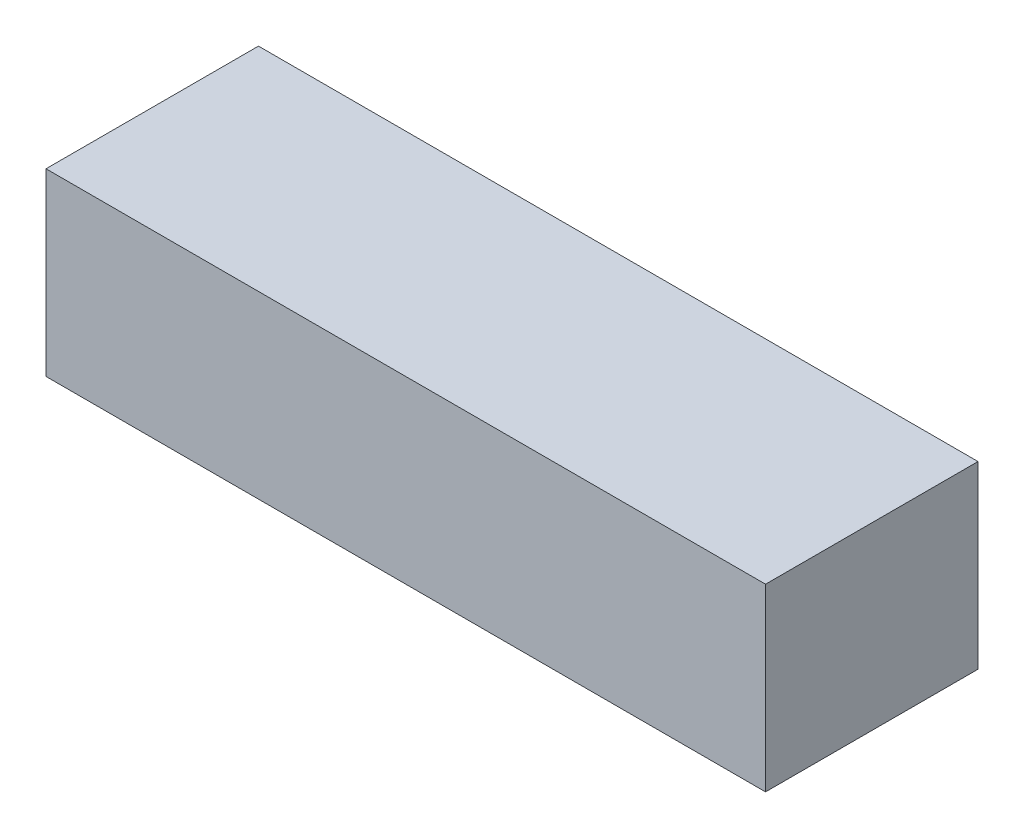
ISO-10303-21;
HEADER;
FILE_DESCRIPTION(('STEP AP214'),'2;1');
FILE_NAME('part.step','',(''),(''),'','','');
FILE_SCHEMA(('AUTOMOTIVE_DESIGN { 1 0 10303 214 1 1 1 1 }'));
ENDSEC;
DATA;
#1=APPLICATION_CONTEXT('core data for automotive mechanical design processes');
#2=APPLICATION_PROTOCOL_DEFINITION('international standard','automotive_design',2000,#1);
#3=PRODUCT_CONTEXT('',#1,'mechanical');
#4=PRODUCT('Part','Part','',(#3));
#5=PRODUCT_RELATED_PRODUCT_CATEGORY('part','',(#4));
#6=PRODUCT_DEFINITION_FORMATION('','',#4);
#7=PRODUCT_DEFINITION_CONTEXT('part definition',#1,'design');
#8=PRODUCT_DEFINITION('design','',#6,#7);
#9=PRODUCT_DEFINITION_SHAPE('','',#8);
#10=(LENGTH_UNIT() NAMED_UNIT(*) SI_UNIT(.MILLI.,.METRE.));
#11=(NAMED_UNIT(*) PLANE_ANGLE_UNIT() SI_UNIT($,.RADIAN.));
#12=(NAMED_UNIT(*) SI_UNIT($,.STERADIAN.) SOLID_ANGLE_UNIT());
#13=UNCERTAINTY_MEASURE_WITH_UNIT(LENGTH_MEASURE(1.E-05),#10,'distance_accuracy_value','');
#14=(GEOMETRIC_REPRESENTATION_CONTEXT(3) GLOBAL_UNCERTAINTY_ASSIGNED_CONTEXT((#13)) GLOBAL_UNIT_ASSIGNED_CONTEXT((#10,
#11,#12)) REPRESENTATION_CONTEXT('',''));
#15=CARTESIAN_POINT('',(0.,0.,0.));
#16=DIRECTION('',(0.,0.,1.));
#17=DIRECTION('',(1.,0.,0.));
#18=AXIS2_PLACEMENT_3D('',#15,#16,#17);
#19=CARTESIAN_POINT('',(-1.27,-1.27,2.));
#20=DIRECTION('',(0.,1.,0.));
#21=DIRECTION('',(0.,0.,1.));
#22=AXIS2_PLACEMENT_3D('',#19,#20,#21);
#23=PLANE('',#22);
#24=DIRECTION('',(0.,0.,1.));
#25=VECTOR('',#24,1.);
#26=CARTESIAN_POINT('',(8.89,-1.27,2.));
#27=LINE('',#26,#25);
#28=CARTESIAN_POINT('',(8.89,-1.27,2.));
#29=VERTEX_POINT('',#28);
#30=CARTESIAN_POINT('',(8.89,-1.27,5.));
#31=VERTEX_POINT('',#30);
#32=EDGE_CURVE('E20',#29,#31,#27,.T.);
#33=ORIENTED_EDGE('',*,*,#32,.T.);
#34=DIRECTION('',(-1.,0.,0.));
#35=VECTOR('',#34,1.);
#36=CARTESIAN_POINT('',(8.89,-1.27,5.));
#37=LINE('',#36,#35);
#38=CARTESIAN_POINT('',(-1.27,-1.27,5.));
#39=VERTEX_POINT('',#38);
#40=EDGE_CURVE('E55',#31,#39,#37,.T.);
#41=ORIENTED_EDGE('',*,*,#40,.T.);
#42=DIRECTION('',(0.,0.,-1.));
#43=VECTOR('',#42,1.);
#44=CARTESIAN_POINT('',(-1.27,-1.27,2.));
#45=LINE('',#44,#43);
#46=CARTESIAN_POINT('',(-1.27,-1.27,2.));
#47=VERTEX_POINT('',#46);
#48=EDGE_CURVE('E76',#39,#47,#45,.T.);
#49=ORIENTED_EDGE('',*,*,#48,.T.);
#50=DIRECTION('',(-1.,0.,0.));
#51=VECTOR('',#50,1.);
#52=CARTESIAN_POINT('',(8.89,-1.27,2.));
#53=LINE('',#52,#51);
#54=EDGE_CURVE('E58',#29,#47,#53,.T.);
#55=ORIENTED_EDGE('',*,*,#54,.F.);
#56=EDGE_LOOP('',(#33,#41,#49,#55));
#57=FACE_BOUND('',#56,.T.);
#58=ADVANCED_FACE('F17',(#57),#23,.F.);
#59=CARTESIAN_POINT('',(8.89,-1.27,2.));
#60=DIRECTION('',(-1.,0.,0.));
#61=DIRECTION('',(0.,0.,1.));
#62=AXIS2_PLACEMENT_3D('',#59,#60,#61);
#63=PLANE('',#62);
#64=DIRECTION('',(0.,0.,-1.));
#65=VECTOR('',#64,1.);
#66=CARTESIAN_POINT('',(8.89,1.27,2.));
#67=LINE('',#66,#65);
#68=CARTESIAN_POINT('',(8.89,1.27,2.));
#69=VERTEX_POINT('',#68);
#70=CARTESIAN_POINT('',(8.89,1.27,5.));
#71=VERTEX_POINT('',#70);
#72=EDGE_CURVE('E73',#69,#71,#67,.F.);
#73=ORIENTED_EDGE('',*,*,#72,.T.);
#74=DIRECTION('',(0.,1.,0.));
#75=VECTOR('',#74,1.);
#76=CARTESIAN_POINT('',(8.89,1.27,5.));
#77=LINE('',#76,#75);
#78=EDGE_CURVE('E63',#71,#31,#77,.F.);
#79=ORIENTED_EDGE('',*,*,#78,.T.);
#80=ORIENTED_EDGE('',*,*,#32,.F.);
#81=DIRECTION('',(0.,1.,0.));
#82=VECTOR('',#81,1.);
#83=CARTESIAN_POINT('',(8.89,1.27,2.));
#84=LINE('',#83,#82);
#85=EDGE_CURVE('E78',#69,#29,#84,.F.);
#86=ORIENTED_EDGE('',*,*,#85,.F.);
#87=EDGE_LOOP('',(#73,#79,#80,#86));
#88=FACE_BOUND('',#87,.T.);
#89=ADVANCED_FACE('F72',(#88),#63,.F.);
#90=CARTESIAN_POINT('',(8.89,1.27,5.));
#91=DIRECTION('',(0.,0.,-1.));
#92=DIRECTION('',(-1.,0.,0.));
#93=AXIS2_PLACEMENT_3D('',#90,#91,#92);
#94=PLANE('',#93);
#95=DIRECTION('',(0.,1.,0.));
#96=VECTOR('',#95,1.);
#97=CARTESIAN_POINT('',(-1.27,1.27,5.));
#98=LINE('',#97,#96);
#99=CARTESIAN_POINT('',(-1.27,1.27,5.));
#100=VERTEX_POINT('',#99);
#101=EDGE_CURVE('E69',#100,#39,#98,.F.);
#102=ORIENTED_EDGE('',*,*,#101,.T.);
#103=ORIENTED_EDGE('',*,*,#40,.F.);
#104=ORIENTED_EDGE('',*,*,#78,.F.);
#105=DIRECTION('',(1.,0.,0.));
#106=VECTOR('',#105,1.);
#107=CARTESIAN_POINT('',(8.89,1.27,5.));
#108=LINE('',#107,#106);
#109=EDGE_CURVE('E83',#71,#100,#108,.F.);
#110=ORIENTED_EDGE('',*,*,#109,.T.);
#111=EDGE_LOOP('',(#102,#103,#104,#110));
#112=FACE_BOUND('',#111,.T.);
#113=ADVANCED_FACE('F66',(#112),#94,.F.);
#114=CARTESIAN_POINT('',(-1.27,1.27,2.));
#115=DIRECTION('',(1.,0.,0.));
#116=DIRECTION('',(0.,0.,-1.));
#117=AXIS2_PLACEMENT_3D('',#114,#115,#116);
#118=PLANE('',#117);
#119=ORIENTED_EDGE('',*,*,#48,.F.);
#120=ORIENTED_EDGE('',*,*,#101,.F.);
#121=DIRECTION('',(0.,0.,-1.));
#122=VECTOR('',#121,1.);
#123=CARTESIAN_POINT('',(-1.27,1.27,2.));
#124=LINE('',#123,#122);
#125=CARTESIAN_POINT('',(-1.27,1.27,2.));
#126=VERTEX_POINT('',#125);
#127=EDGE_CURVE('E26',#100,#126,#124,.T.);
#128=ORIENTED_EDGE('',*,*,#127,.T.);
#129=DIRECTION('',(0.,1.,0.));
#130=VECTOR('',#129,1.);
#131=CARTESIAN_POINT('',(-1.27,1.27,2.));
#132=LINE('',#131,#130);
#133=EDGE_CURVE('E34',#47,#126,#132,.T.);
#134=ORIENTED_EDGE('',*,*,#133,.F.);
#135=EDGE_LOOP('',(#119,#120,#128,#134));
#136=FACE_BOUND('',#135,.T.);
#137=ADVANCED_FACE('F88',(#136),#118,.F.);
#138=CARTESIAN_POINT('',(8.89,1.27,2.));
#139=DIRECTION('',(0.,0.,-1.));
#140=DIRECTION('',(-1.,0.,0.));
#141=AXIS2_PLACEMENT_3D('',#138,#139,#140);
#142=PLANE('',#141);
#143=ORIENTED_EDGE('',*,*,#133,.T.);
#144=DIRECTION('',(1.,0.,0.));
#145=VECTOR('',#144,1.);
#146=CARTESIAN_POINT('',(8.89,1.27,2.));
#147=LINE('',#146,#145);
#148=EDGE_CURVE('E11',#126,#69,#147,.T.);
#149=ORIENTED_EDGE('',*,*,#148,.T.);
#150=ORIENTED_EDGE('',*,*,#85,.T.);
#151=ORIENTED_EDGE('',*,*,#54,.T.);
#152=EDGE_LOOP('',(#143,#149,#150,#151));
#153=FACE_BOUND('',#152,.T.);
#154=ADVANCED_FACE('F91',(#153),#142,.T.);
#155=CARTESIAN_POINT('',(8.89,1.27,2.));
#156=DIRECTION('',(0.,-1.,0.));
#157=DIRECTION('',(0.,0.,-1.));
#158=AXIS2_PLACEMENT_3D('',#155,#156,#157);
#159=PLANE('',#158);
#160=ORIENTED_EDGE('',*,*,#127,.F.);
#161=ORIENTED_EDGE('',*,*,#109,.F.);
#162=ORIENTED_EDGE('',*,*,#72,.F.);
#163=ORIENTED_EDGE('',*,*,#148,.F.);
#164=EDGE_LOOP('',(#160,#161,#162,#163));
#165=FACE_BOUND('',#164,.T.);
#166=ADVANCED_FACE('F90',(#165),#159,.F.);
#167=CLOSED_SHELL('',(#58,#89,#113,#137,#154,#166));
#168=MANIFOLD_SOLID_BREP('B1',#167);
#169=ADVANCED_BREP_SHAPE_REPRESENTATION('',(#18,#168),#14);
#170=SHAPE_DEFINITION_REPRESENTATION(#9,#169);
ENDSEC;
END-ISO-10303-21;
